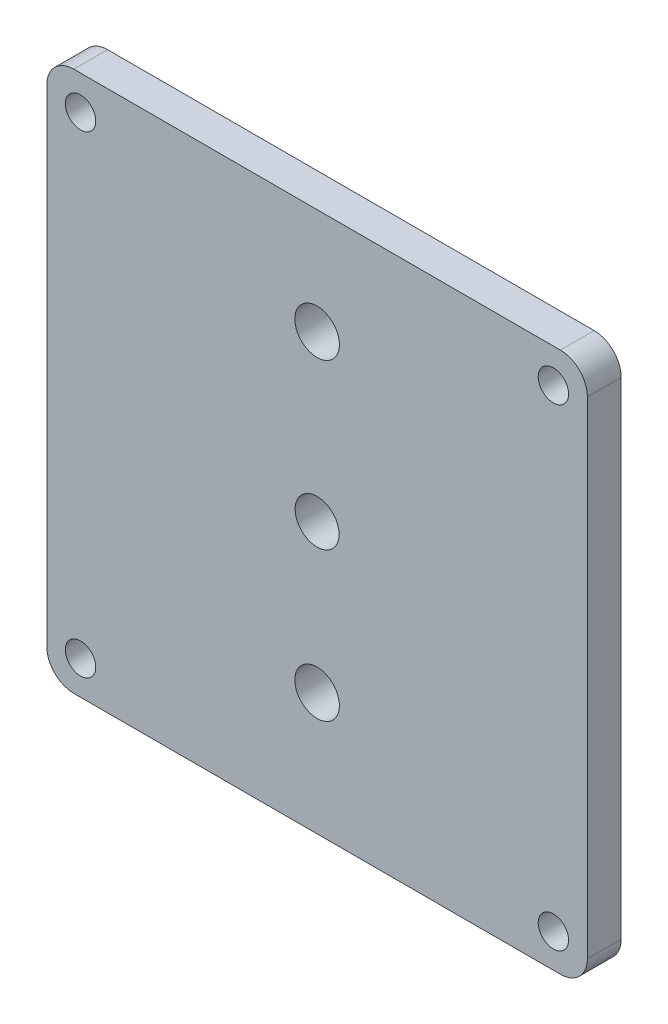
ISO-10303-21;
HEADER;
FILE_DESCRIPTION(('STEP AP214'),'2;1');
FILE_NAME('part.step','',(''),(''),'','','');
FILE_SCHEMA(('AUTOMOTIVE_DESIGN { 1 0 10303 214 1 1 1 1 }'));
ENDSEC;
DATA;
#1=APPLICATION_CONTEXT('core data for automotive mechanical design processes');
#2=APPLICATION_PROTOCOL_DEFINITION('international standard','automotive_design',2000,#1);
#3=PRODUCT_CONTEXT('',#1,'mechanical');
#4=PRODUCT('Part','Part','',(#3));
#5=PRODUCT_RELATED_PRODUCT_CATEGORY('part','',(#4));
#6=PRODUCT_DEFINITION_FORMATION('','',#4);
#7=PRODUCT_DEFINITION_CONTEXT('part definition',#1,'design');
#8=PRODUCT_DEFINITION('design','',#6,#7);
#9=PRODUCT_DEFINITION_SHAPE('','',#8);
#10=(LENGTH_UNIT() NAMED_UNIT(*) SI_UNIT(.MILLI.,.METRE.));
#11=(NAMED_UNIT(*) PLANE_ANGLE_UNIT() SI_UNIT($,.RADIAN.));
#12=(NAMED_UNIT(*) SI_UNIT($,.STERADIAN.) SOLID_ANGLE_UNIT());
#13=UNCERTAINTY_MEASURE_WITH_UNIT(LENGTH_MEASURE(1.E-05),#10,'distance_accuracy_value','');
#14=(GEOMETRIC_REPRESENTATION_CONTEXT(3) GLOBAL_UNCERTAINTY_ASSIGNED_CONTEXT((#13)) GLOBAL_UNIT_ASSIGNED_CONTEXT((#10,
#11,#12)) REPRESENTATION_CONTEXT('',''));
#15=CARTESIAN_POINT('',(0.,0.,0.));
#16=DIRECTION('',(0.,0.,1.));
#17=DIRECTION('',(1.,0.,0.));
#18=AXIS2_PLACEMENT_3D('',#15,#16,#17);
#19=CARTESIAN_POINT('',(-36.,-36.,0.));
#20=DIRECTION('',(0.,0.,-1.));
#21=DIRECTION('',(-1.,0.,0.));
#22=AXIS2_PLACEMENT_3D('',#19,#20,#21);
#23=PLANE('',#22);
#24=CARTESIAN_POINT('',(0.,-21.9164480782013,0.));
#25=DIRECTION('',(0.,0.,-1.));
#26=DIRECTION('',(-1.,0.,0.));
#27=AXIS2_PLACEMENT_3D('',#24,#25,#26);
#28=CIRCLE('',#27,3.29999999999999);
#29=CARTESIAN_POINT('',(-3.29999999999999,-21.9164480782013,0.));
#30=VERTEX_POINT('',#29);
#31=EDGE_CURVE('E216',#30,#30,#28,.T.);
#32=ORIENTED_EDGE('',*,*,#31,.F.);
#33=EDGE_LOOP('',(#32));
#34=FACE_BOUND('',#33,.T.);
#35=CARTESIAN_POINT('',(0.,24.3463761548171,0.));
#36=DIRECTION('',(0.,0.,-1.));
#37=DIRECTION('',(-1.,0.,0.));
#38=AXIS2_PLACEMENT_3D('',#35,#36,#37);
#39=CIRCLE('',#38,3.29999999999999);
#40=CARTESIAN_POINT('',(-3.29999999999999,24.3463761548171,0.));
#41=VERTEX_POINT('',#40);
#42=EDGE_CURVE('E210',#41,#41,#39,.T.);
#43=ORIENTED_EDGE('',*,*,#42,.F.);
#44=EDGE_LOOP('',(#43));
#45=FACE_BOUND('',#44,.T.);
#46=CARTESIAN_POINT('',(0.,0.,0.));
#47=DIRECTION('',(0.,0.,-1.));
#48=DIRECTION('',(-1.,0.,0.));
#49=AXIS2_PLACEMENT_3D('',#46,#47,#48);
#50=CIRCLE('',#49,3.25);
#51=CARTESIAN_POINT('',(-3.25,0.,0.));
#52=VERTEX_POINT('',#51);
#53=EDGE_CURVE('E202',#52,#52,#50,.T.);
#54=ORIENTED_EDGE('',*,*,#53,.F.);
#55=EDGE_LOOP('',(#54));
#56=FACE_BOUND('',#55,.T.);
#57=CARTESIAN_POINT('',(-35.0076226985767,34.9623801641174,0.));
#58=DIRECTION('',(0.,0.,1.));
#59=DIRECTION('',(1.,0.,0.));
#60=AXIS2_PLACEMENT_3D('',#57,#58,#59);
#61=CIRCLE('',#60,2.24999999999999);
#62=CARTESIAN_POINT('',(-32.7576226985767,34.9623801641174,0.));
#63=VERTEX_POINT('',#62);
#64=EDGE_CURVE('E195',#63,#63,#61,.T.);
#65=ORIENTED_EDGE('',*,*,#64,.T.);
#66=EDGE_LOOP('',(#65));
#67=FACE_BOUND('',#66,.T.);
#68=CARTESIAN_POINT('',(34.9683536446484,34.9623801641172,0.));
#69=DIRECTION('',(0.,0.,1.));
#70=DIRECTION('',(1.,0.,0.));
#71=AXIS2_PLACEMENT_3D('',#68,#69,#70);
#72=CIRCLE('',#71,2.24999999999999);
#73=CARTESIAN_POINT('',(37.2183536446484,34.9623801641172,0.));
#74=VERTEX_POINT('',#73);
#75=EDGE_CURVE('E189',#74,#74,#72,.T.);
#76=ORIENTED_EDGE('',*,*,#75,.T.);
#77=EDGE_LOOP('',(#76));
#78=FACE_BOUND('',#77,.T.);
#79=CARTESIAN_POINT('',(34.9683536446482,-35.0238813325822,0.));
#80=DIRECTION('',(0.,0.,1.));
#81=DIRECTION('',(1.,0.,0.));
#82=AXIS2_PLACEMENT_3D('',#79,#80,#81);
#83=CIRCLE('',#82,2.24999999999999);
#84=CARTESIAN_POINT('',(37.2183536446482,-35.0238813325822,0.));
#85=VERTEX_POINT('',#84);
#86=EDGE_CURVE('E183',#85,#85,#83,.T.);
#87=ORIENTED_EDGE('',*,*,#86,.T.);
#88=EDGE_LOOP('',(#87));
#89=FACE_BOUND('',#88,.T.);
#90=CARTESIAN_POINT('',(-36.,-36.,0.));
#91=DIRECTION('',(0.,0.,1.));
#92=DIRECTION('',(-1.,0.,0.));
#93=AXIS2_PLACEMENT_3D('',#90,#91,#92);
#94=CIRCLE('',#93,4.);
#95=CARTESIAN_POINT('',(-40.,-36.,0.));
#96=VERTEX_POINT('',#95);
#97=CARTESIAN_POINT('',(-36.,-40.,0.));
#98=VERTEX_POINT('',#97);
#99=EDGE_CURVE('E130',#96,#98,#94,.T.);
#100=ORIENTED_EDGE('',*,*,#99,.F.);
#101=DIRECTION('',(0.,-1.,0.));
#102=VECTOR('',#101,1.);
#103=CARTESIAN_POINT('',(-40.,-36.,0.));
#104=LINE('',#103,#102);
#105=CARTESIAN_POINT('',(-40.,36.,0.));
#106=VERTEX_POINT('',#105);
#107=EDGE_CURVE('E85',#106,#96,#104,.T.);
#108=ORIENTED_EDGE('',*,*,#107,.F.);
#109=CARTESIAN_POINT('',(-36.,36.,0.));
#110=DIRECTION('',(0.,0.,1.));
#111=DIRECTION('',(-1.,0.,0.));
#112=AXIS2_PLACEMENT_3D('',#109,#110,#111);
#113=CIRCLE('',#112,4.);
#114=CARTESIAN_POINT('',(-36.,40.,0.));
#115=VERTEX_POINT('',#114);
#116=EDGE_CURVE('E79',#115,#106,#113,.T.);
#117=ORIENTED_EDGE('',*,*,#116,.F.);
#118=DIRECTION('',(-1.,0.,0.));
#119=VECTOR('',#118,1.);
#120=CARTESIAN_POINT('',(-36.,40.,0.));
#121=LINE('',#120,#119);
#122=CARTESIAN_POINT('',(36.,40.,0.));
#123=VERTEX_POINT('',#122);
#124=EDGE_CURVE('E120',#123,#115,#121,.T.);
#125=ORIENTED_EDGE('',*,*,#124,.F.);
#126=CARTESIAN_POINT('',(36.,36.,0.));
#127=DIRECTION('',(0.,0.,1.));
#128=DIRECTION('',(1.,0.,0.));
#129=AXIS2_PLACEMENT_3D('',#126,#127,#128);
#130=CIRCLE('',#129,4.);
#131=CARTESIAN_POINT('',(40.,36.,0.));
#132=VERTEX_POINT('',#131);
#133=EDGE_CURVE('E140',#132,#123,#130,.T.);
#134=ORIENTED_EDGE('',*,*,#133,.F.);
#135=DIRECTION('',(0.,1.,0.));
#136=VECTOR('',#135,1.);
#137=CARTESIAN_POINT('',(40.,-36.,0.));
#138=LINE('',#137,#136);
#139=CARTESIAN_POINT('',(40.,-36.,0.));
#140=VERTEX_POINT('',#139);
#141=EDGE_CURVE('E138',#140,#132,#138,.T.);
#142=ORIENTED_EDGE('',*,*,#141,.F.);
#143=CARTESIAN_POINT('',(36.,-36.,0.));
#144=DIRECTION('',(0.,0.,1.));
#145=DIRECTION('',(1.,0.,0.));
#146=AXIS2_PLACEMENT_3D('',#143,#144,#145);
#147=CIRCLE('',#146,4.);
#148=CARTESIAN_POINT('',(36.,-40.,0.));
#149=VERTEX_POINT('',#148);
#150=EDGE_CURVE('E136',#149,#140,#147,.T.);
#151=ORIENTED_EDGE('',*,*,#150,.F.);
#152=DIRECTION('',(1.,0.,0.));
#153=VECTOR('',#152,1.);
#154=CARTESIAN_POINT('',(-36.,-40.,0.));
#155=LINE('',#154,#153);
#156=EDGE_CURVE('E133',#98,#149,#155,.T.);
#157=ORIENTED_EDGE('',*,*,#156,.F.);
#158=EDGE_LOOP('',(#100,#108,#117,#125,#134,#142,#151,#157));
#159=FACE_BOUND('',#158,.T.);
#160=CARTESIAN_POINT('',(-35.0076226985769,-35.023881332582,0.));
#161=DIRECTION('',(0.,0.,1.));
#162=DIRECTION('',(1.,0.,0.));
#163=AXIS2_PLACEMENT_3D('',#160,#161,#162);
#164=CIRCLE('',#163,2.24999999999999);
#165=CARTESIAN_POINT('',(-32.7576226985769,-35.023881332582,0.));
#166=VERTEX_POINT('',#165);
#167=EDGE_CURVE('E134',#166,#166,#164,.T.);
#168=ORIENTED_EDGE('',*,*,#167,.T.);
#169=EDGE_LOOP('',(#168));
#170=FACE_BOUND('',#169,.T.);
#171=ADVANCED_FACE('F33',(#34,#45,#56,#67,#78,#89,#159,#170),#23,.T.);
#172=CARTESIAN_POINT('',(-36.,-36.,5.));
#173=DIRECTION('',(0.,0.,-1.));
#174=DIRECTION('',(-1.,0.,0.));
#175=AXIS2_PLACEMENT_3D('',#172,#173,#174);
#176=CYLINDRICAL_SURFACE('',#175,4.);
#177=ORIENTED_EDGE('',*,*,#99,.T.);
#178=DIRECTION('',(0.,0.,-1.));
#179=VECTOR('',#178,1.);
#180=CARTESIAN_POINT('',(-36.,-40.,5.));
#181=LINE('',#180,#179);
#182=CARTESIAN_POINT('',(-36.,-40.,5.));
#183=VERTEX_POINT('',#182);
#184=EDGE_CURVE('E11',#183,#98,#181,.T.);
#185=ORIENTED_EDGE('',*,*,#184,.F.);
#186=CARTESIAN_POINT('',(-36.,-36.,5.));
#187=DIRECTION('',(0.,0.,1.));
#188=DIRECTION('',(-1.,0.,0.));
#189=AXIS2_PLACEMENT_3D('',#186,#187,#188);
#190=CIRCLE('',#189,4.);
#191=CARTESIAN_POINT('',(-40.,-36.,5.));
#192=VERTEX_POINT('',#191);
#193=EDGE_CURVE('E145',#192,#183,#190,.T.);
#194=ORIENTED_EDGE('',*,*,#193,.F.);
#195=DIRECTION('',(0.,0.,-1.));
#196=VECTOR('',#195,1.);
#197=CARTESIAN_POINT('',(-40.,-36.,5.));
#198=LINE('',#197,#196);
#199=EDGE_CURVE('E126',#192,#96,#198,.T.);
#200=ORIENTED_EDGE('',*,*,#199,.T.);
#201=EDGE_LOOP('',(#177,#185,#194,#200));
#202=FACE_BOUND('',#201,.T.);
#203=ADVANCED_FACE('F35',(#202),#176,.T.);
#204=CARTESIAN_POINT('',(-36.,-40.,5.));
#205=DIRECTION('',(0.,1.,0.));
#206=DIRECTION('',(0.,0.,1.));
#207=AXIS2_PLACEMENT_3D('',#204,#205,#206);
#208=PLANE('',#207);
#209=ORIENTED_EDGE('',*,*,#156,.T.);
#210=DIRECTION('',(0.,0.,-1.));
#211=VECTOR('',#210,1.);
#212=CARTESIAN_POINT('',(36.,-40.,5.));
#213=LINE('',#212,#211);
#214=CARTESIAN_POINT('',(36.,-40.,5.));
#215=VERTEX_POINT('',#214);
#216=EDGE_CURVE('E42',#215,#149,#213,.T.);
#217=ORIENTED_EDGE('',*,*,#216,.F.);
#218=DIRECTION('',(1.,0.,0.));
#219=VECTOR('',#218,1.);
#220=CARTESIAN_POINT('',(-36.,-40.,5.));
#221=LINE('',#220,#219);
#222=EDGE_CURVE('E93',#183,#215,#221,.T.);
#223=ORIENTED_EDGE('',*,*,#222,.F.);
#224=ORIENTED_EDGE('',*,*,#184,.T.);
#225=EDGE_LOOP('',(#209,#217,#223,#224));
#226=FACE_BOUND('',#225,.T.);
#227=ADVANCED_FACE('F270',(#226),#208,.F.);
#228=CARTESIAN_POINT('',(36.,-36.,5.));
#229=DIRECTION('',(0.,0.,-1.));
#230=DIRECTION('',(-1.,0.,0.));
#231=AXIS2_PLACEMENT_3D('',#228,#229,#230);
#232=CYLINDRICAL_SURFACE('',#231,4.);
#233=ORIENTED_EDGE('',*,*,#150,.T.);
#234=DIRECTION('',(0.,0.,-1.));
#235=VECTOR('',#234,1.);
#236=CARTESIAN_POINT('',(40.,-36.,5.));
#237=LINE('',#236,#235);
#238=CARTESIAN_POINT('',(40.,-36.,5.));
#239=VERTEX_POINT('',#238);
#240=EDGE_CURVE('E152',#239,#140,#237,.T.);
#241=ORIENTED_EDGE('',*,*,#240,.F.);
#242=CARTESIAN_POINT('',(36.,-36.,5.));
#243=DIRECTION('',(0.,0.,1.));
#244=DIRECTION('',(1.,0.,0.));
#245=AXIS2_PLACEMENT_3D('',#242,#243,#244);
#246=CIRCLE('',#245,4.);
#247=EDGE_CURVE('E160',#215,#239,#246,.T.);
#248=ORIENTED_EDGE('',*,*,#247,.F.);
#249=ORIENTED_EDGE('',*,*,#216,.T.);
#250=EDGE_LOOP('',(#233,#241,#248,#249));
#251=FACE_BOUND('',#250,.T.);
#252=ADVANCED_FACE('F158',(#251),#232,.T.);
#253=CARTESIAN_POINT('',(40.,-36.,5.));
#254=DIRECTION('',(-1.,0.,0.));
#255=DIRECTION('',(0.,0.,1.));
#256=AXIS2_PLACEMENT_3D('',#253,#254,#255);
#257=PLANE('',#256);
#258=ORIENTED_EDGE('',*,*,#141,.T.);
#259=DIRECTION('',(0.,0.,-1.));
#260=VECTOR('',#259,1.);
#261=CARTESIAN_POINT('',(40.,36.,5.));
#262=LINE('',#261,#260);
#263=CARTESIAN_POINT('',(40.,36.,5.));
#264=VERTEX_POINT('',#263);
#265=EDGE_CURVE('E149',#264,#132,#262,.T.);
#266=ORIENTED_EDGE('',*,*,#265,.F.);
#267=DIRECTION('',(0.,1.,0.));
#268=VECTOR('',#267,1.);
#269=CARTESIAN_POINT('',(40.,-36.,5.));
#270=LINE('',#269,#268);
#271=EDGE_CURVE('E172',#239,#264,#270,.T.);
#272=ORIENTED_EDGE('',*,*,#271,.F.);
#273=ORIENTED_EDGE('',*,*,#240,.T.);
#274=EDGE_LOOP('',(#258,#266,#272,#273));
#275=FACE_BOUND('',#274,.T.);
#276=ADVANCED_FACE('F168',(#275),#257,.F.);
#277=CARTESIAN_POINT('',(36.,36.,5.));
#278=DIRECTION('',(0.,0.,-1.));
#279=DIRECTION('',(-1.,0.,0.));
#280=AXIS2_PLACEMENT_3D('',#277,#278,#279);
#281=CYLINDRICAL_SURFACE('',#280,4.);
#282=ORIENTED_EDGE('',*,*,#133,.T.);
#283=DIRECTION('',(0.,0.,-1.));
#284=VECTOR('',#283,1.);
#285=CARTESIAN_POINT('',(36.,40.,5.));
#286=LINE('',#285,#284);
#287=CARTESIAN_POINT('',(36.,40.,5.));
#288=VERTEX_POINT('',#287);
#289=EDGE_CURVE('E121',#288,#123,#286,.T.);
#290=ORIENTED_EDGE('',*,*,#289,.F.);
#291=CARTESIAN_POINT('',(36.,36.,5.));
#292=DIRECTION('',(0.,0.,1.));
#293=DIRECTION('',(1.,0.,0.));
#294=AXIS2_PLACEMENT_3D('',#291,#292,#293);
#295=CIRCLE('',#294,4.);
#296=EDGE_CURVE('E112',#264,#288,#295,.T.);
#297=ORIENTED_EDGE('',*,*,#296,.F.);
#298=ORIENTED_EDGE('',*,*,#265,.T.);
#299=EDGE_LOOP('',(#282,#290,#297,#298));
#300=FACE_BOUND('',#299,.T.);
#301=ADVANCED_FACE('F171',(#300),#281,.T.);
#302=CARTESIAN_POINT('',(-36.,40.,5.));
#303=DIRECTION('',(0.,-1.,0.));
#304=DIRECTION('',(0.,0.,-1.));
#305=AXIS2_PLACEMENT_3D('',#302,#303,#304);
#306=PLANE('',#305);
#307=ORIENTED_EDGE('',*,*,#124,.T.);
#308=DIRECTION('',(0.,0.,-1.));
#309=VECTOR('',#308,1.);
#310=CARTESIAN_POINT('',(-36.,40.,5.));
#311=LINE('',#310,#309);
#312=CARTESIAN_POINT('',(-36.,40.,5.));
#313=VERTEX_POINT('',#312);
#314=EDGE_CURVE('E117',#313,#115,#311,.T.);
#315=ORIENTED_EDGE('',*,*,#314,.F.);
#316=DIRECTION('',(-1.,0.,0.));
#317=VECTOR('',#316,1.);
#318=CARTESIAN_POINT('',(-36.,40.,5.));
#319=LINE('',#318,#317);
#320=EDGE_CURVE('E106',#288,#313,#319,.T.);
#321=ORIENTED_EDGE('',*,*,#320,.F.);
#322=ORIENTED_EDGE('',*,*,#289,.T.);
#323=EDGE_LOOP('',(#307,#315,#321,#322));
#324=FACE_BOUND('',#323,.T.);
#325=ADVANCED_FACE('F118',(#324),#306,.F.);
#326=CARTESIAN_POINT('',(-36.,36.,5.));
#327=DIRECTION('',(0.,0.,-1.));
#328=DIRECTION('',(-1.,0.,0.));
#329=AXIS2_PLACEMENT_3D('',#326,#327,#328);
#330=CYLINDRICAL_SURFACE('',#329,4.);
#331=ORIENTED_EDGE('',*,*,#116,.T.);
#332=DIRECTION('',(0.,0.,-1.));
#333=VECTOR('',#332,1.);
#334=CARTESIAN_POINT('',(-40.,36.,5.));
#335=LINE('',#334,#333);
#336=CARTESIAN_POINT('',(-40.,36.,5.));
#337=VERTEX_POINT('',#336);
#338=EDGE_CURVE('E122',#337,#106,#335,.T.);
#339=ORIENTED_EDGE('',*,*,#338,.F.);
#340=CARTESIAN_POINT('',(-36.,36.,5.));
#341=DIRECTION('',(0.,0.,1.));
#342=DIRECTION('',(-1.,0.,0.));
#343=AXIS2_PLACEMENT_3D('',#340,#341,#342);
#344=CIRCLE('',#343,4.);
#345=EDGE_CURVE('E110',#313,#337,#344,.T.);
#346=ORIENTED_EDGE('',*,*,#345,.F.);
#347=ORIENTED_EDGE('',*,*,#314,.T.);
#348=EDGE_LOOP('',(#331,#339,#346,#347));
#349=FACE_BOUND('',#348,.T.);
#350=ADVANCED_FACE('F124',(#349),#330,.T.);
#351=CARTESIAN_POINT('',(-40.,-36.,5.));
#352=DIRECTION('',(1.,0.,0.));
#353=DIRECTION('',(0.,0.,-1.));
#354=AXIS2_PLACEMENT_3D('',#351,#352,#353);
#355=PLANE('',#354);
#356=ORIENTED_EDGE('',*,*,#107,.T.);
#357=ORIENTED_EDGE('',*,*,#199,.F.);
#358=DIRECTION('',(0.,-1.,0.));
#359=VECTOR('',#358,1.);
#360=CARTESIAN_POINT('',(-40.,-36.,5.));
#361=LINE('',#360,#359);
#362=EDGE_CURVE('E50',#337,#192,#361,.T.);
#363=ORIENTED_EDGE('',*,*,#362,.F.);
#364=ORIENTED_EDGE('',*,*,#338,.T.);
#365=EDGE_LOOP('',(#356,#357,#363,#364));
#366=FACE_BOUND('',#365,.T.);
#367=ADVANCED_FACE('F245',(#366),#355,.F.);
#368=CARTESIAN_POINT('',(-36.,-36.,5.));
#369=DIRECTION('',(0.,0.,-1.));
#370=DIRECTION('',(-1.,0.,0.));
#371=AXIS2_PLACEMENT_3D('',#368,#369,#370);
#372=PLANE('',#371);
#373=CARTESIAN_POINT('',(0.,-21.9164480782013,5.));
#374=DIRECTION('',(0.,0.,-1.));
#375=DIRECTION('',(-1.,0.,0.));
#376=AXIS2_PLACEMENT_3D('',#373,#374,#375);
#377=CIRCLE('',#376,3.3);
#378=CARTESIAN_POINT('',(-3.3,-21.9164480782013,5.));
#379=VERTEX_POINT('',#378);
#380=EDGE_CURVE('E213',#379,#379,#377,.T.);
#381=ORIENTED_EDGE('',*,*,#380,.T.);
#382=EDGE_LOOP('',(#381));
#383=FACE_BOUND('',#382,.T.);
#384=CARTESIAN_POINT('',(0.,24.3463761548171,5.));
#385=DIRECTION('',(0.,0.,-1.));
#386=DIRECTION('',(-1.,0.,0.));
#387=AXIS2_PLACEMENT_3D('',#384,#385,#386);
#388=CIRCLE('',#387,3.3);
#389=CARTESIAN_POINT('',(-3.3,24.3463761548171,5.));
#390=VERTEX_POINT('',#389);
#391=EDGE_CURVE('E205',#390,#390,#388,.T.);
#392=ORIENTED_EDGE('',*,*,#391,.T.);
#393=EDGE_LOOP('',(#392));
#394=FACE_BOUND('',#393,.T.);
#395=CARTESIAN_POINT('',(0.,0.,5.));
#396=DIRECTION('',(0.,0.,-1.));
#397=DIRECTION('',(-1.,0.,0.));
#398=AXIS2_PLACEMENT_3D('',#395,#396,#397);
#399=CIRCLE('',#398,3.25);
#400=CARTESIAN_POINT('',(-3.25,0.,5.));
#401=VERTEX_POINT('',#400);
#402=EDGE_CURVE('E201',#401,#401,#399,.T.);
#403=ORIENTED_EDGE('',*,*,#402,.T.);
#404=EDGE_LOOP('',(#403));
#405=FACE_BOUND('',#404,.T.);
#406=CARTESIAN_POINT('',(-35.0076226985767,34.9623801641174,5.));
#407=DIRECTION('',(0.,0.,1.));
#408=DIRECTION('',(1.,0.,0.));
#409=AXIS2_PLACEMENT_3D('',#406,#407,#408);
#410=CIRCLE('',#409,2.24999999999999);
#411=CARTESIAN_POINT('',(-32.7576226985767,34.9623801641174,5.));
#412=VERTEX_POINT('',#411);
#413=EDGE_CURVE('E198',#412,#412,#410,.T.);
#414=ORIENTED_EDGE('',*,*,#413,.F.);
#415=EDGE_LOOP('',(#414));
#416=FACE_BOUND('',#415,.T.);
#417=CARTESIAN_POINT('',(34.9683536446484,34.9623801641172,5.));
#418=DIRECTION('',(0.,0.,1.));
#419=DIRECTION('',(1.,0.,0.));
#420=AXIS2_PLACEMENT_3D('',#417,#418,#419);
#421=CIRCLE('',#420,2.24999999999999);
#422=CARTESIAN_POINT('',(37.2183536446484,34.9623801641172,5.));
#423=VERTEX_POINT('',#422);
#424=EDGE_CURVE('E192',#423,#423,#421,.T.);
#425=ORIENTED_EDGE('',*,*,#424,.F.);
#426=EDGE_LOOP('',(#425));
#427=FACE_BOUND('',#426,.T.);
#428=CARTESIAN_POINT('',(34.9683536446482,-35.0238813325822,5.));
#429=DIRECTION('',(0.,0.,1.));
#430=DIRECTION('',(1.,0.,0.));
#431=AXIS2_PLACEMENT_3D('',#428,#429,#430);
#432=CIRCLE('',#431,2.24999999999999);
#433=CARTESIAN_POINT('',(37.2183536446482,-35.0238813325822,5.));
#434=VERTEX_POINT('',#433);
#435=EDGE_CURVE('E186',#434,#434,#432,.T.);
#436=ORIENTED_EDGE('',*,*,#435,.F.);
#437=EDGE_LOOP('',(#436));
#438=FACE_BOUND('',#437,.T.);
#439=CARTESIAN_POINT('',(-35.0076226985769,-35.023881332582,5.));
#440=DIRECTION('',(0.,0.,1.));
#441=DIRECTION('',(1.,0.,0.));
#442=AXIS2_PLACEMENT_3D('',#439,#440,#441);
#443=CIRCLE('',#442,2.24999999999999);
#444=CARTESIAN_POINT('',(-32.7576226985769,-35.023881332582,5.));
#445=VERTEX_POINT('',#444);
#446=EDGE_CURVE('E180',#445,#445,#443,.T.);
#447=ORIENTED_EDGE('',*,*,#446,.F.);
#448=EDGE_LOOP('',(#447));
#449=FACE_BOUND('',#448,.T.);
#450=ORIENTED_EDGE('',*,*,#193,.T.);
#451=ORIENTED_EDGE('',*,*,#222,.T.);
#452=ORIENTED_EDGE('',*,*,#247,.T.);
#453=ORIENTED_EDGE('',*,*,#271,.T.);
#454=ORIENTED_EDGE('',*,*,#296,.T.);
#455=ORIENTED_EDGE('',*,*,#320,.T.);
#456=ORIENTED_EDGE('',*,*,#345,.T.);
#457=ORIENTED_EDGE('',*,*,#362,.T.);
#458=EDGE_LOOP('',(#450,#451,#452,#453,#454,#455,#456,#457));
#459=FACE_BOUND('',#458,.T.);
#460=ADVANCED_FACE('F108',(#383,#394,#405,#416,#427,#438,#449,#459),#372,.F.);
#461=CARTESIAN_POINT('',(-35.0076226985769,-35.023881332582,5.));
#462=DIRECTION('',(0.,0.,1.));
#463=DIRECTION('',(1.,0.,0.));
#464=AXIS2_PLACEMENT_3D('',#461,#462,#463);
#465=CYLINDRICAL_SURFACE('',#464,2.24999999999999);
#466=ORIENTED_EDGE('',*,*,#167,.F.);
#467=EDGE_LOOP('',(#466));
#468=FACE_BOUND('',#467,.T.);
#469=ORIENTED_EDGE('',*,*,#446,.T.);
#470=EDGE_LOOP('',(#469));
#471=FACE_BOUND('',#470,.T.);
#472=ADVANCED_FACE('F239',(#468,#471),#465,.F.);
#473=CARTESIAN_POINT('',(34.9683536446482,-35.0238813325822,5.));
#474=DIRECTION('',(0.,0.,1.));
#475=DIRECTION('',(1.,0.,0.));
#476=AXIS2_PLACEMENT_3D('',#473,#474,#475);
#477=CYLINDRICAL_SURFACE('',#476,2.24999999999999);
#478=ORIENTED_EDGE('',*,*,#86,.F.);
#479=EDGE_LOOP('',(#478));
#480=FACE_BOUND('',#479,.T.);
#481=ORIENTED_EDGE('',*,*,#435,.T.);
#482=EDGE_LOOP('',(#481));
#483=FACE_BOUND('',#482,.T.);
#484=ADVANCED_FACE('F235',(#480,#483),#477,.F.);
#485=CARTESIAN_POINT('',(34.9683536446484,34.9623801641172,5.));
#486=DIRECTION('',(0.,0.,1.));
#487=DIRECTION('',(1.,0.,0.));
#488=AXIS2_PLACEMENT_3D('',#485,#486,#487);
#489=CYLINDRICAL_SURFACE('',#488,2.24999999999999);
#490=ORIENTED_EDGE('',*,*,#75,.F.);
#491=EDGE_LOOP('',(#490));
#492=FACE_BOUND('',#491,.T.);
#493=ORIENTED_EDGE('',*,*,#424,.T.);
#494=EDGE_LOOP('',(#493));
#495=FACE_BOUND('',#494,.T.);
#496=ADVANCED_FACE('F238',(#492,#495),#489,.F.);
#497=CARTESIAN_POINT('',(-35.0076226985767,34.9623801641174,5.));
#498=DIRECTION('',(0.,0.,1.));
#499=DIRECTION('',(1.,0.,0.));
#500=AXIS2_PLACEMENT_3D('',#497,#498,#499);
#501=CYLINDRICAL_SURFACE('',#500,2.24999999999999);
#502=ORIENTED_EDGE('',*,*,#64,.F.);
#503=EDGE_LOOP('',(#502));
#504=FACE_BOUND('',#503,.T.);
#505=ORIENTED_EDGE('',*,*,#413,.T.);
#506=EDGE_LOOP('',(#505));
#507=FACE_BOUND('',#506,.T.);
#508=ADVANCED_FACE('F342',(#504,#507),#501,.F.);
#509=CARTESIAN_POINT('',(0.,0.,5.));
#510=DIRECTION('',(0.,0.,-1.));
#511=DIRECTION('',(-1.,0.,0.));
#512=AXIS2_PLACEMENT_3D('',#509,#510,#511);
#513=CYLINDRICAL_SURFACE('',#512,3.25);
#514=ORIENTED_EDGE('',*,*,#402,.F.);
#515=EDGE_LOOP('',(#514));
#516=FACE_BOUND('',#515,.T.);
#517=ORIENTED_EDGE('',*,*,#53,.T.);
#518=EDGE_LOOP('',(#517));
#519=FACE_BOUND('',#518,.T.);
#520=ADVANCED_FACE('F351',(#516,#519),#513,.F.);
#521=CARTESIAN_POINT('',(0.,24.3463761548171,0.));
#522=DIRECTION('',(0.,0.,-1.));
#523=DIRECTION('',(-1.,0.,0.));
#524=AXIS2_PLACEMENT_3D('',#521,#522,#523);
#525=CYLINDRICAL_SURFACE('',#524,3.29999999999999);
#526=ORIENTED_EDGE('',*,*,#391,.F.);
#527=EDGE_LOOP('',(#526));
#528=FACE_BOUND('',#527,.T.);
#529=ORIENTED_EDGE('',*,*,#42,.T.);
#530=EDGE_LOOP('',(#529));
#531=FACE_BOUND('',#530,.T.);
#532=ADVANCED_FACE('F360',(#528,#531),#525,.F.);
#533=CARTESIAN_POINT('',(0.,-21.9164480782013,0.));
#534=DIRECTION('',(0.,0.,-1.));
#535=DIRECTION('',(-1.,0.,0.));
#536=AXIS2_PLACEMENT_3D('',#533,#534,#535);
#537=CYLINDRICAL_SURFACE('',#536,3.29999999999999);
#538=ORIENTED_EDGE('',*,*,#380,.F.);
#539=EDGE_LOOP('',(#538));
#540=FACE_BOUND('',#539,.T.);
#541=ORIENTED_EDGE('',*,*,#31,.T.);
#542=EDGE_LOOP('',(#541));
#543=FACE_BOUND('',#542,.T.);
#544=ADVANCED_FACE('F220',(#540,#543),#537,.F.);
#545=CLOSED_SHELL('',(#171,#203,#227,#252,#276,#301,#325,#350,#367,#460,#472,#484,#496,#508,
#520,#532,#544));
#546=MANIFOLD_SOLID_BREP('B2',#545);
#547=ADVANCED_BREP_SHAPE_REPRESENTATION('',(#18,#546),#14);
#548=SHAPE_DEFINITION_REPRESENTATION(#9,#547);
ENDSEC;
END-ISO-10303-21;
